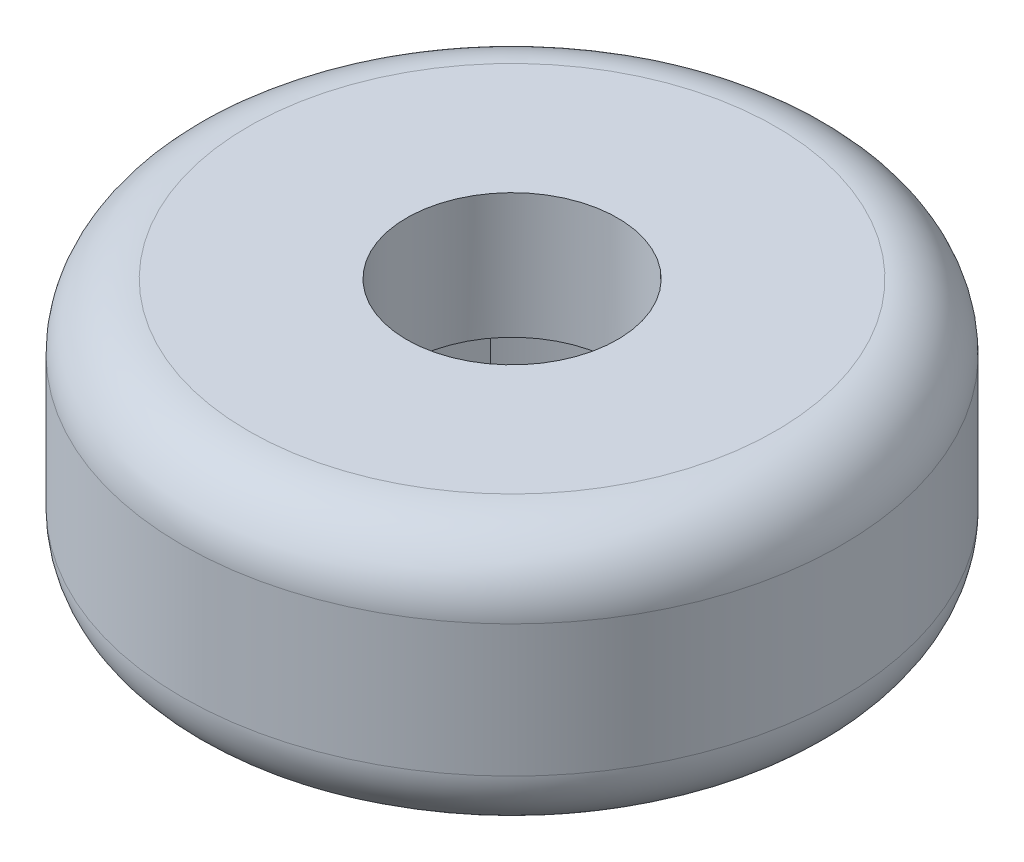
ISO-10303-21;
HEADER;
FILE_DESCRIPTION(('STEP AP214'),'2;1');
FILE_NAME('part.step','',(''),(''),'','','');
FILE_SCHEMA(('AUTOMOTIVE_DESIGN { 1 0 10303 214 1 1 1 1 }'));
ENDSEC;
DATA;
#1=APPLICATION_CONTEXT('core data for automotive mechanical design processes');
#2=APPLICATION_PROTOCOL_DEFINITION('international standard','automotive_design',2000,#1);
#3=PRODUCT_CONTEXT('',#1,'mechanical');
#4=PRODUCT('Part','Part','',(#3));
#5=PRODUCT_RELATED_PRODUCT_CATEGORY('part','',(#4));
#6=PRODUCT_DEFINITION_FORMATION('','',#4);
#7=PRODUCT_DEFINITION_CONTEXT('part definition',#1,'design');
#8=PRODUCT_DEFINITION('design','',#6,#7);
#9=PRODUCT_DEFINITION_SHAPE('','',#8);
#10=(LENGTH_UNIT() NAMED_UNIT(*) SI_UNIT(.MILLI.,.METRE.));
#11=(NAMED_UNIT(*) PLANE_ANGLE_UNIT() SI_UNIT($,.RADIAN.));
#12=(NAMED_UNIT(*) SI_UNIT($,.STERADIAN.) SOLID_ANGLE_UNIT());
#13=UNCERTAINTY_MEASURE_WITH_UNIT(LENGTH_MEASURE(1.E-05),#10,'distance_accuracy_value','');
#14=(GEOMETRIC_REPRESENTATION_CONTEXT(3) GLOBAL_UNCERTAINTY_ASSIGNED_CONTEXT((#13)) GLOBAL_UNIT_ASSIGNED_CONTEXT((#10,
#11,#12)) REPRESENTATION_CONTEXT('',''));
#15=CARTESIAN_POINT('',(0.,0.,0.));
#16=DIRECTION('',(0.,0.,1.));
#17=DIRECTION('',(1.,0.,0.));
#18=AXIS2_PLACEMENT_3D('',#15,#16,#17);
#19=CARTESIAN_POINT('',(0.,0.,0.));
#20=DIRECTION('',(0.,1.,0.));
#21=DIRECTION('',(0.,0.,1.));
#22=AXIS2_PLACEMENT_3D('',#19,#20,#21);
#23=PLANE('',#22);
#24=CARTESIAN_POINT('',(-75.0852984379265,0.,-13.6477233628339));
#25=DIRECTION('',(0.,1.,0.));
#26=DIRECTION('',(0.,0.,1.));
#27=AXIS2_PLACEMENT_3D('',#24,#25,#26);
#28=CIRCLE('',#27,4.);
#29=CARTESIAN_POINT('',(-75.0852984379265,0.,-9.64772336283394));
#30=VERTEX_POINT('',#29);
#31=EDGE_CURVE('E47',#30,#30,#28,.F.);
#32=ORIENTED_EDGE('',*,*,#31,.T.);
#33=EDGE_LOOP('',(#32));
#34=FACE_BOUND('',#33,.T.);
#35=DIRECTION('',(0.,0.,-1.));
#36=VECTOR('',#35,1.);
#37=CARTESIAN_POINT('',(-72.7352984379265,0.,0.));
#38=LINE('',#37,#36);
#39=CARTESIAN_POINT('',(-72.7352984379265,0.,-11.6259667009184));
#40=VERTEX_POINT('',#39);
#41=CARTESIAN_POINT('',(-72.7352984379265,0.,-15.6694800247495));
#42=VERTEX_POINT('',#41);
#43=EDGE_CURVE('E54',#40,#42,#38,.T.);
#44=ORIENTED_EDGE('',*,*,#43,.T.);
#45=CARTESIAN_POINT('',(-75.0852984379265,0.,-13.6477233628339));
#46=DIRECTION('',(0.,-1.,0.));
#47=DIRECTION('',(0.,0.,-1.));
#48=AXIS2_PLACEMENT_3D('',#45,#46,#47);
#49=CIRCLE('',#48,3.1);
#50=CARTESIAN_POINT('',(-77.4352984379265,0.,-15.6694800247495));
#51=VERTEX_POINT('',#50);
#52=EDGE_CURVE('E104',#51,#42,#49,.T.);
#53=ORIENTED_EDGE('',*,*,#52,.F.);
#54=DIRECTION('',(0.,0.,-1.));
#55=VECTOR('',#54,1.);
#56=CARTESIAN_POINT('',(-77.4352984379265,0.,0.));
#57=LINE('',#56,#55);
#58=CARTESIAN_POINT('',(-77.4352984379265,0.,-11.6259667009184));
#59=VERTEX_POINT('',#58);
#60=EDGE_CURVE('E112',#59,#51,#57,.T.);
#61=ORIENTED_EDGE('',*,*,#60,.F.);
#62=CARTESIAN_POINT('',(-75.0852984379265,0.,-13.6477233628339));
#63=DIRECTION('',(0.,-1.,0.));
#64=DIRECTION('',(0.,0.,-1.));
#65=AXIS2_PLACEMENT_3D('',#62,#63,#64);
#66=CIRCLE('',#65,3.1);
#67=EDGE_CURVE('E88',#40,#59,#66,.T.);
#68=ORIENTED_EDGE('',*,*,#67,.F.);
#69=EDGE_LOOP('',(#44,#53,#61,#68));
#70=FACE_BOUND('',#69,.T.);
#71=ADVANCED_FACE('F39',(#34,#70),#23,.F.);
#72=CARTESIAN_POINT('',(-75.0852984379265,4.,-13.6477233628339));
#73=DIRECTION('',(0.,-1.,0.));
#74=DIRECTION('',(0.,0.,-1.));
#75=AXIS2_PLACEMENT_3D('',#72,#73,#74);
#76=CYLINDRICAL_SURFACE('',#75,5.);
#77=CARTESIAN_POINT('',(-75.0852984379265,1.,-13.6477233628339));
#78=DIRECTION('',(0.,1.,0.));
#79=DIRECTION('',(0.,0.,1.));
#80=AXIS2_PLACEMENT_3D('',#77,#78,#79);
#81=CIRCLE('',#80,5.);
#82=CARTESIAN_POINT('',(-75.0852984379265,1.,-8.64772336283395));
#83=VERTEX_POINT('',#82);
#84=EDGE_CURVE('E124',#83,#83,#81,.T.);
#85=ORIENTED_EDGE('',*,*,#84,.T.);
#86=EDGE_LOOP('',(#85));
#87=FACE_BOUND('',#86,.T.);
#88=CARTESIAN_POINT('',(-75.0852984379265,3.,-13.6477233628339));
#89=DIRECTION('',(0.,1.,0.));
#90=DIRECTION('',(0.,0.,1.));
#91=AXIS2_PLACEMENT_3D('',#88,#89,#90);
#92=CIRCLE('',#91,5.);
#93=CARTESIAN_POINT('',(-75.0852984379265,3.,-8.64772336283395));
#94=VERTEX_POINT('',#93);
#95=EDGE_CURVE('E116',#94,#94,#92,.F.);
#96=ORIENTED_EDGE('',*,*,#95,.T.);
#97=EDGE_LOOP('',(#96));
#98=FACE_BOUND('',#97,.T.);
#99=ADVANCED_FACE('F137',(#87,#98),#76,.T.);
#100=CARTESIAN_POINT('',(0.,4.,0.));
#101=DIRECTION('',(0.,1.,0.));
#102=DIRECTION('',(0.,0.,1.));
#103=AXIS2_PLACEMENT_3D('',#100,#101,#102);
#104=PLANE('',#103);
#105=CARTESIAN_POINT('',(-75.0852984379265,4.,-13.6477233628339));
#106=DIRECTION('',(0.,1.,0.));
#107=DIRECTION('',(0.,0.,1.));
#108=AXIS2_PLACEMENT_3D('',#105,#106,#107);
#109=CIRCLE('',#108,4.);
#110=CARTESIAN_POINT('',(-75.0852984379265,4.,-9.64772336283394));
#111=VERTEX_POINT('',#110);
#112=EDGE_CURVE('E11',#111,#111,#109,.T.);
#113=ORIENTED_EDGE('',*,*,#112,.T.);
#114=EDGE_LOOP('',(#113));
#115=FACE_BOUND('',#114,.T.);
#116=CARTESIAN_POINT('',(-75.0852984379265,4.,-13.6477233628339));
#117=DIRECTION('',(0.,1.,0.));
#118=DIRECTION('',(0.,0.,1.));
#119=AXIS2_PLACEMENT_3D('',#116,#117,#118);
#120=CIRCLE('',#119,1.6);
#121=CARTESIAN_POINT('',(-75.0852984379265,4.,-12.0477233628339));
#122=VERTEX_POINT('',#121);
#123=EDGE_CURVE('E121',#122,#122,#120,.T.);
#124=ORIENTED_EDGE('',*,*,#123,.F.);
#125=EDGE_LOOP('',(#124));
#126=FACE_BOUND('',#125,.T.);
#127=ADVANCED_FACE('F140',(#115,#126),#104,.T.);
#128=CARTESIAN_POINT('',(-72.7352984379265,2.1,0.));
#129=DIRECTION('',(-1.,0.,0.));
#130=DIRECTION('',(0.,0.,1.));
#131=AXIS2_PLACEMENT_3D('',#128,#129,#130);
#132=PLANE('',#131);
#133=ORIENTED_EDGE('',*,*,#43,.F.);
#134=DIRECTION('',(0.,-1.,0.));
#135=VECTOR('',#134,1.);
#136=CARTESIAN_POINT('',(-72.7352984379265,2.1,-11.6259667009184));
#137=LINE('',#136,#135);
#138=CARTESIAN_POINT('',(-72.7352984379265,2.1,-11.6259667009184));
#139=VERTEX_POINT('',#138);
#140=EDGE_CURVE('E77',#139,#40,#137,.T.);
#141=ORIENTED_EDGE('',*,*,#140,.F.);
#142=DIRECTION('',(0.,0.,-1.));
#143=VECTOR('',#142,1.);
#144=CARTESIAN_POINT('',(-72.7352984379265,2.1,0.));
#145=LINE('',#144,#143);
#146=CARTESIAN_POINT('',(-72.7352984379265,2.1,-15.6694800247495));
#147=VERTEX_POINT('',#146);
#148=EDGE_CURVE('E60',#139,#147,#145,.T.);
#149=ORIENTED_EDGE('',*,*,#148,.T.);
#150=DIRECTION('',(0.,-1.,0.));
#151=VECTOR('',#150,1.);
#152=CARTESIAN_POINT('',(-72.7352984379265,2.1,-15.6694800247495));
#153=LINE('',#152,#151);
#154=EDGE_CURVE('E74',#147,#42,#153,.T.);
#155=ORIENTED_EDGE('',*,*,#154,.T.);
#156=EDGE_LOOP('',(#133,#141,#149,#155));
#157=FACE_BOUND('',#156,.T.);
#158=ADVANCED_FACE('F150',(#157),#132,.T.);
#159=CARTESIAN_POINT('',(-75.0852984379265,2.1,-13.6477233628339));
#160=DIRECTION('',(0.,-1.,0.));
#161=DIRECTION('',(0.,0.,-1.));
#162=AXIS2_PLACEMENT_3D('',#159,#160,#161);
#163=CYLINDRICAL_SURFACE('',#162,3.1);
#164=ORIENTED_EDGE('',*,*,#52,.T.);
#165=ORIENTED_EDGE('',*,*,#154,.F.);
#166=CARTESIAN_POINT('',(-75.0852984379265,2.1,-13.6477233628339));
#167=DIRECTION('',(0.,-1.,0.));
#168=DIRECTION('',(0.,0.,-1.));
#169=AXIS2_PLACEMENT_3D('',#166,#167,#168);
#170=CIRCLE('',#169,3.1);
#171=CARTESIAN_POINT('',(-77.4352984379265,2.1,-15.6694800247495));
#172=VERTEX_POINT('',#171);
#173=EDGE_CURVE('E100',#172,#147,#170,.T.);
#174=ORIENTED_EDGE('',*,*,#173,.F.);
#175=DIRECTION('',(0.,-1.,0.));
#176=VECTOR('',#175,1.);
#177=CARTESIAN_POINT('',(-77.4352984379265,2.1,-15.6694800247495));
#178=LINE('',#177,#176);
#179=EDGE_CURVE('E92',#172,#51,#178,.T.);
#180=ORIENTED_EDGE('',*,*,#179,.T.);
#181=EDGE_LOOP('',(#164,#165,#174,#180));
#182=FACE_BOUND('',#181,.T.);
#183=ADVANCED_FACE('F170',(#182),#163,.F.);
#184=CARTESIAN_POINT('',(-77.4352984379265,2.1,0.));
#185=DIRECTION('',(-1.,0.,0.));
#186=DIRECTION('',(0.,0.,1.));
#187=AXIS2_PLACEMENT_3D('',#184,#185,#186);
#188=PLANE('',#187);
#189=ORIENTED_EDGE('',*,*,#60,.T.);
#190=ORIENTED_EDGE('',*,*,#179,.F.);
#191=DIRECTION('',(0.,0.,-1.));
#192=VECTOR('',#191,1.);
#193=CARTESIAN_POINT('',(-77.4352984379265,2.1,0.));
#194=LINE('',#193,#192);
#195=CARTESIAN_POINT('',(-77.4352984379265,2.1,-11.6259667009184));
#196=VERTEX_POINT('',#195);
#197=EDGE_CURVE('E95',#196,#172,#194,.T.);
#198=ORIENTED_EDGE('',*,*,#197,.F.);
#199=DIRECTION('',(0.,-1.,0.));
#200=VECTOR('',#199,1.);
#201=CARTESIAN_POINT('',(-77.4352984379265,2.1,-11.6259667009184));
#202=LINE('',#201,#200);
#203=EDGE_CURVE('E82',#196,#59,#202,.T.);
#204=ORIENTED_EDGE('',*,*,#203,.T.);
#205=EDGE_LOOP('',(#189,#190,#198,#204));
#206=FACE_BOUND('',#205,.T.);
#207=ADVANCED_FACE('F96',(#206),#188,.F.);
#208=CARTESIAN_POINT('',(-75.0852984379265,2.1,-13.6477233628339));
#209=DIRECTION('',(0.,-1.,0.));
#210=DIRECTION('',(0.,0.,-1.));
#211=AXIS2_PLACEMENT_3D('',#208,#209,#210);
#212=CYLINDRICAL_SURFACE('',#211,3.1);
#213=ORIENTED_EDGE('',*,*,#67,.T.);
#214=ORIENTED_EDGE('',*,*,#203,.F.);
#215=CARTESIAN_POINT('',(-75.0852984379265,2.1,-13.6477233628339));
#216=DIRECTION('',(0.,-1.,0.));
#217=DIRECTION('',(0.,0.,-1.));
#218=AXIS2_PLACEMENT_3D('',#215,#216,#217);
#219=CIRCLE('',#218,3.1);
#220=EDGE_CURVE('E86',#139,#196,#219,.T.);
#221=ORIENTED_EDGE('',*,*,#220,.F.);
#222=ORIENTED_EDGE('',*,*,#140,.T.);
#223=EDGE_LOOP('',(#213,#214,#221,#222));
#224=FACE_BOUND('',#223,.T.);
#225=ADVANCED_FACE('F84',(#224),#212,.F.);
#226=CARTESIAN_POINT('',(0.,2.1,0.));
#227=DIRECTION('',(0.,-1.,0.));
#228=DIRECTION('',(0.,0.,-1.));
#229=AXIS2_PLACEMENT_3D('',#226,#227,#228);
#230=PLANE('',#229);
#231=CARTESIAN_POINT('',(-75.0852984379265,2.1,-13.6477233628339));
#232=DIRECTION('',(0.,-1.,0.));
#233=DIRECTION('',(0.,0.,-1.));
#234=AXIS2_PLACEMENT_3D('',#231,#232,#233);
#235=CIRCLE('',#234,1.6);
#236=CARTESIAN_POINT('',(-75.0852984379265,2.1,-15.247723362834));
#237=VERTEX_POINT('',#236);
#238=EDGE_CURVE('E110',#237,#237,#235,.T.);
#239=ORIENTED_EDGE('',*,*,#238,.F.);
#240=EDGE_LOOP('',(#239));
#241=FACE_BOUND('',#240,.T.);
#242=ORIENTED_EDGE('',*,*,#148,.F.);
#243=ORIENTED_EDGE('',*,*,#220,.T.);
#244=ORIENTED_EDGE('',*,*,#197,.T.);
#245=ORIENTED_EDGE('',*,*,#173,.T.);
#246=EDGE_LOOP('',(#242,#243,#244,#245));
#247=FACE_BOUND('',#246,.T.);
#248=ADVANCED_FACE('F102',(#241,#247),#230,.T.);
#249=CARTESIAN_POINT('',(-75.0852984379265,1.,-13.6477233628339));
#250=DIRECTION('',(0.,1.,0.));
#251=DIRECTION('',(0.,0.,1.));
#252=AXIS2_PLACEMENT_3D('',#249,#250,#251);
#253=CYLINDRICAL_SURFACE('',#252,1.6);
#254=ORIENTED_EDGE('',*,*,#238,.T.);
#255=EDGE_LOOP('',(#254));
#256=FACE_BOUND('',#255,.T.);
#257=ORIENTED_EDGE('',*,*,#123,.T.);
#258=EDGE_LOOP('',(#257));
#259=FACE_BOUND('',#258,.T.);
#260=ADVANCED_FACE('F134',(#256,#259),#253,.F.);
#261=CARTESIAN_POINT('',(-75.0852984379265,1.,-13.6477233628339));
#262=DIRECTION('',(0.,1.,0.));
#263=DIRECTION('',(0.,0.,1.));
#264=AXIS2_PLACEMENT_3D('',#261,#262,#263);
#265=TOROIDAL_SURFACE('',#264,4.,1.);
#266=ORIENTED_EDGE('',*,*,#31,.F.);
#267=EDGE_LOOP('',(#266));
#268=FACE_BOUND('',#267,.T.);
#269=ORIENTED_EDGE('',*,*,#84,.F.);
#270=EDGE_LOOP('',(#269));
#271=FACE_BOUND('',#270,.T.);
#272=ADVANCED_FACE('F131',(#268,#271),#265,.T.);
#273=CARTESIAN_POINT('',(-75.0852984379265,3.,-13.6477233628339));
#274=DIRECTION('',(0.,1.,0.));
#275=DIRECTION('',(0.,0.,1.));
#276=AXIS2_PLACEMENT_3D('',#273,#274,#275);
#277=TOROIDAL_SURFACE('',#276,4.,1.);
#278=ORIENTED_EDGE('',*,*,#95,.F.);
#279=EDGE_LOOP('',(#278));
#280=FACE_BOUND('',#279,.T.);
#281=ORIENTED_EDGE('',*,*,#112,.F.);
#282=EDGE_LOOP('',(#281));
#283=FACE_BOUND('',#282,.T.);
#284=ADVANCED_FACE('F41',(#280,#283),#277,.T.);
#285=CLOSED_SHELL('',(#71,#99,#127,#158,#183,#207,#225,#248,#260,#272,#284));
#286=MANIFOLD_SOLID_BREP('B2',#285);
#287=ADVANCED_BREP_SHAPE_REPRESENTATION('',(#18,#286),#14);
#288=SHAPE_DEFINITION_REPRESENTATION(#9,#287);
ENDSEC;
END-ISO-10303-21;
